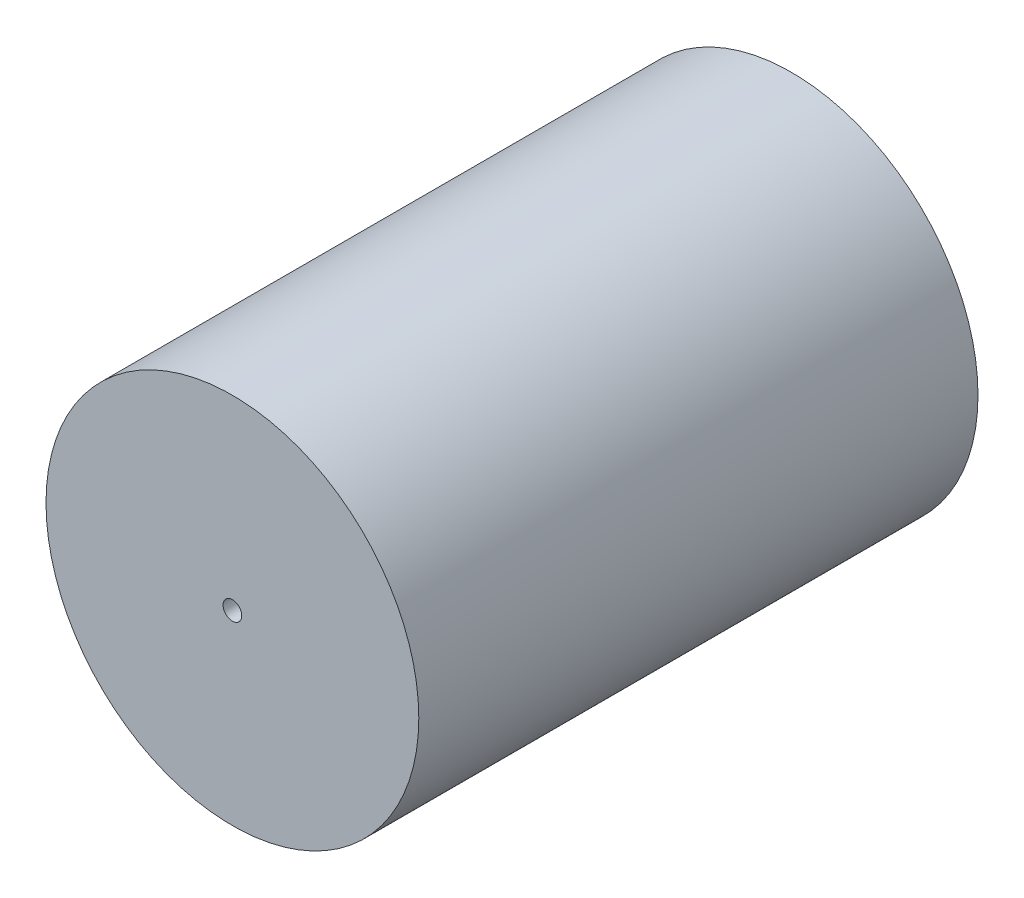
ISO-10303-21;
HEADER;
FILE_DESCRIPTION(('STEP AP214'),'2;1');
FILE_NAME('part.step','',(''),(''),'','','');
FILE_SCHEMA(('AUTOMOTIVE_DESIGN { 1 0 10303 214 1 1 1 1 }'));
ENDSEC;
DATA;
#1=APPLICATION_CONTEXT('core data for automotive mechanical design processes');
#2=APPLICATION_PROTOCOL_DEFINITION('international standard','automotive_design',2000,#1);
#3=PRODUCT_CONTEXT('',#1,'mechanical');
#4=PRODUCT('Part','Part','',(#3));
#5=PRODUCT_RELATED_PRODUCT_CATEGORY('part','',(#4));
#6=PRODUCT_DEFINITION_FORMATION('','',#4);
#7=PRODUCT_DEFINITION_CONTEXT('part definition',#1,'design');
#8=PRODUCT_DEFINITION('design','',#6,#7);
#9=PRODUCT_DEFINITION_SHAPE('','',#8);
#10=(LENGTH_UNIT() NAMED_UNIT(*) SI_UNIT(.MILLI.,.METRE.));
#11=(NAMED_UNIT(*) PLANE_ANGLE_UNIT() SI_UNIT($,.RADIAN.));
#12=(NAMED_UNIT(*) SI_UNIT($,.STERADIAN.) SOLID_ANGLE_UNIT());
#13=UNCERTAINTY_MEASURE_WITH_UNIT(LENGTH_MEASURE(1.E-05),#10,'distance_accuracy_value','');
#14=(GEOMETRIC_REPRESENTATION_CONTEXT(3) GLOBAL_UNCERTAINTY_ASSIGNED_CONTEXT((#13)) GLOBAL_UNIT_ASSIGNED_CONTEXT((#10,
#11,#12)) REPRESENTATION_CONTEXT('',''));
#15=CARTESIAN_POINT('',(0.,0.,0.));
#16=DIRECTION('',(0.,0.,1.));
#17=DIRECTION('',(1.,0.,0.));
#18=AXIS2_PLACEMENT_3D('',#15,#16,#17);
#19=CARTESIAN_POINT('',(0.,0.,300.));
#20=DIRECTION('',(0.,0.,1.));
#21=DIRECTION('',(1.,0.,0.));
#22=AXIS2_PLACEMENT_3D('',#19,#20,#21);
#23=PLANE('',#22);
#24=CARTESIAN_POINT('',(0.,0.,300.));
#25=DIRECTION('',(0.,0.,1.));
#26=DIRECTION('',(1.,0.,0.));
#27=AXIS2_PLACEMENT_3D('',#24,#25,#26);
#28=CIRCLE('',#27,100.);
#29=CARTESIAN_POINT('',(100.,0.,300.));
#30=VERTEX_POINT('',#29);
#31=EDGE_CURVE('E10',#30,#30,#28,.T.);
#32=ORIENTED_EDGE('',*,*,#31,.T.);
#33=EDGE_LOOP('',(#32));
#34=FACE_BOUND('',#33,.T.);
#35=CARTESIAN_POINT('',(0.,0.,300.));
#36=DIRECTION('',(0.,0.,1.));
#37=DIRECTION('',(1.,0.,0.));
#38=AXIS2_PLACEMENT_3D('',#35,#36,#37);
#39=CIRCLE('',#38,5.);
#40=CARTESIAN_POINT('',(5.,0.,300.));
#41=VERTEX_POINT('',#40);
#42=EDGE_CURVE('E45',#41,#41,#39,.T.);
#43=ORIENTED_EDGE('',*,*,#42,.F.);
#44=EDGE_LOOP('',(#43));
#45=FACE_BOUND('',#44,.T.);
#46=ADVANCED_FACE('F34',(#34,#45),#23,.T.);
#47=CARTESIAN_POINT('',(0.,0.,0.));
#48=DIRECTION('',(0.,0.,1.));
#49=DIRECTION('',(1.,0.,0.));
#50=AXIS2_PLACEMENT_3D('',#47,#48,#49);
#51=PLANE('',#50);
#52=CARTESIAN_POINT('',(0.,0.,0.));
#53=DIRECTION('',(0.,0.,1.));
#54=DIRECTION('',(1.,0.,0.));
#55=AXIS2_PLACEMENT_3D('',#52,#53,#54);
#56=CIRCLE('',#55,100.);
#57=CARTESIAN_POINT('',(100.,0.,0.));
#58=VERTEX_POINT('',#57);
#59=EDGE_CURVE('E38',#58,#58,#56,.T.);
#60=ORIENTED_EDGE('',*,*,#59,.F.);
#61=EDGE_LOOP('',(#60));
#62=FACE_BOUND('',#61,.T.);
#63=CARTESIAN_POINT('',(0.,0.,0.));
#64=DIRECTION('',(0.,0.,1.));
#65=DIRECTION('',(1.,0.,0.));
#66=AXIS2_PLACEMENT_3D('',#63,#64,#65);
#67=CIRCLE('',#66,5.);
#68=CARTESIAN_POINT('',(5.,0.,0.));
#69=VERTEX_POINT('',#68);
#70=EDGE_CURVE('E47',#69,#69,#67,.T.);
#71=ORIENTED_EDGE('',*,*,#70,.T.);
#72=EDGE_LOOP('',(#71));
#73=FACE_BOUND('',#72,.T.);
#74=ADVANCED_FACE('F57',(#62,#73),#51,.F.);
#75=CARTESIAN_POINT('',(0.,0.,300.));
#76=DIRECTION('',(0.,0.,-1.));
#77=DIRECTION('',(-1.,0.,0.));
#78=AXIS2_PLACEMENT_3D('',#75,#76,#77);
#79=CYLINDRICAL_SURFACE('',#78,100.);
#80=ORIENTED_EDGE('',*,*,#31,.F.);
#81=EDGE_LOOP('',(#80));
#82=FACE_BOUND('',#81,.T.);
#83=ORIENTED_EDGE('',*,*,#59,.T.);
#84=EDGE_LOOP('',(#83));
#85=FACE_BOUND('',#84,.T.);
#86=ADVANCED_FACE('F36',(#82,#85),#79,.T.);
#87=CARTESIAN_POINT('',(0.,0.,300.));
#88=DIRECTION('',(0.,0.,-1.));
#89=DIRECTION('',(-1.,0.,0.));
#90=AXIS2_PLACEMENT_3D('',#87,#88,#89);
#91=CYLINDRICAL_SURFACE('',#90,5.);
#92=ORIENTED_EDGE('',*,*,#42,.T.);
#93=EDGE_LOOP('',(#92));
#94=FACE_BOUND('',#93,.T.);
#95=ORIENTED_EDGE('',*,*,#70,.F.);
#96=EDGE_LOOP('',(#95));
#97=FACE_BOUND('',#96,.T.);
#98=ADVANCED_FACE('F53',(#94,#97),#91,.F.);
#99=CLOSED_SHELL('',(#46,#74,#86,#98));
#100=MANIFOLD_SOLID_BREP('B2',#99);
#101=ADVANCED_BREP_SHAPE_REPRESENTATION('',(#18,#100),#14);
#102=SHAPE_DEFINITION_REPRESENTATION(#9,#101);
ENDSEC;
END-ISO-10303-21;
